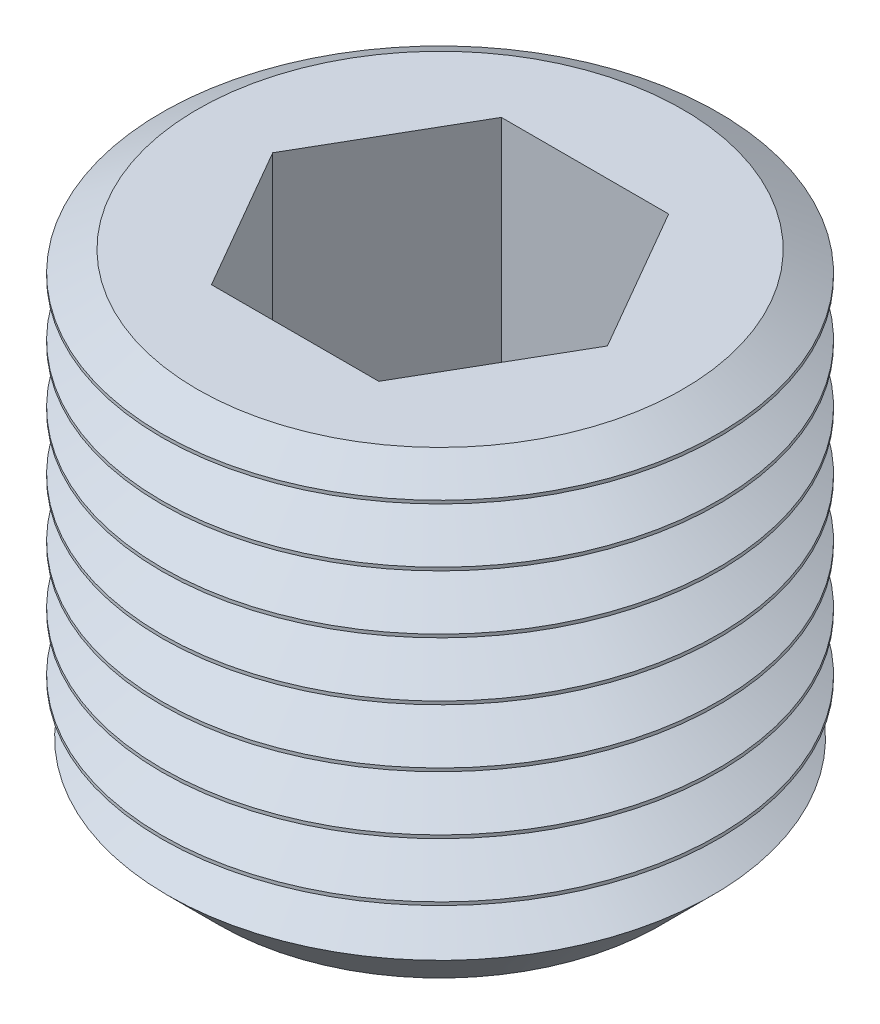
ISO-10303-21;
HEADER;
FILE_DESCRIPTION(('STEP AP214'),'2;1');
FILE_NAME('part.step','',(''),(''),'','','');
FILE_SCHEMA(('AUTOMOTIVE_DESIGN { 1 0 10303 214 1 1 1 1 }'));
ENDSEC;
DATA;
#1=APPLICATION_CONTEXT('core data for automotive mechanical design processes');
#2=APPLICATION_PROTOCOL_DEFINITION('international standard','automotive_design',2000,#1);
#3=PRODUCT_CONTEXT('',#1,'mechanical');
#4=PRODUCT('Part','Part','',(#3));
#5=PRODUCT_RELATED_PRODUCT_CATEGORY('part','',(#4));
#6=PRODUCT_DEFINITION_FORMATION('','',#4);
#7=PRODUCT_DEFINITION_CONTEXT('part definition',#1,'design');
#8=PRODUCT_DEFINITION('design','',#6,#7);
#9=PRODUCT_DEFINITION_SHAPE('','',#8);
#10=(LENGTH_UNIT() NAMED_UNIT(*) SI_UNIT(.MILLI.,.METRE.));
#11=(NAMED_UNIT(*) PLANE_ANGLE_UNIT() SI_UNIT($,.RADIAN.));
#12=(NAMED_UNIT(*) SI_UNIT($,.STERADIAN.) SOLID_ANGLE_UNIT());
#13=UNCERTAINTY_MEASURE_WITH_UNIT(LENGTH_MEASURE(1.E-05),#10,'distance_accuracy_value','');
#14=(GEOMETRIC_REPRESENTATION_CONTEXT(3) GLOBAL_UNCERTAINTY_ASSIGNED_CONTEXT((#13)) GLOBAL_UNIT_ASSIGNED_CONTEXT((#10,
#11,#12)) REPRESENTATION_CONTEXT('',''));
#15=CARTESIAN_POINT('',(0.,0.,0.));
#16=DIRECTION('',(0.,0.,1.));
#17=DIRECTION('',(1.,0.,0.));
#18=AXIS2_PLACEMENT_3D('',#15,#16,#17);
#19=CARTESIAN_POINT('',(6.01723710062803E-11,-3.64906545824845,0.));
#20=DIRECTION('',(0.,1.,0.));
#21=DIRECTION('',(0.,0.,1.));
#22=AXIS2_PLACEMENT_3D('',#19,#20,#21);
#23=CONICAL_SURFACE('',#22,2.35093454176649,0.785398163397449);
#24=CARTESIAN_POINT('',(6.01723710062803E-11,-4.09999999998029,0.));
#25=DIRECTION('',(0.,1.,0.));
#26=DIRECTION('',(0.,0.,1.));
#27=AXIS2_PLACEMENT_3D('',#24,#25,#26);
#28=CIRCLE('',#27,1.90000000003465);
#29=CARTESIAN_POINT('',(6.01723710062803E-11,-4.09999999998029,1.90000000003465));
#30=VERTEX_POINT('',#29);
#31=EDGE_CURVE('E140',#30,#30,#28,.T.);
#32=ORIENTED_EDGE('',*,*,#31,.T.);
#33=EDGE_LOOP('',(#32));
#34=FACE_BOUND('',#33,.T.);
#35=CARTESIAN_POINT('',(6.01723710062803E-11,-3.64906545824845,0.));
#36=DIRECTION('',(0.,1.,0.));
#37=DIRECTION('',(0.,0.,1.));
#38=AXIS2_PLACEMENT_3D('',#35,#36,#37);
#39=CIRCLE('',#38,2.35093454176649);
#40=CARTESIAN_POINT('',(6.01723710062803E-11,-3.64906545824845,2.35093454176649));
#41=VERTEX_POINT('',#40);
#42=EDGE_CURVE('E11',#41,#41,#39,.T.);
#43=ORIENTED_EDGE('',*,*,#42,.F.);
#44=EDGE_LOOP('',(#43));
#45=FACE_BOUND('',#44,.T.);
#46=ADVANCED_FACE('F39',(#34,#45),#23,.T.);
#47=CARTESIAN_POINT('',(6.01723710062803E-11,-3.44123448050846,0.));
#48=DIRECTION('',(0.,-1.,0.));
#49=DIRECTION('',(0.,0.,-1.));
#50=AXIS2_PLACEMENT_3D('',#47,#48,#49);
#51=CONICAL_SURFACE('',#50,1.99096072893412,1.0471975511966);
#52=ORIENTED_EDGE('',*,*,#42,.T.);
#53=EDGE_LOOP('',(#52));
#54=FACE_BOUND('',#53,.T.);
#55=CARTESIAN_POINT('',(6.01723710062803E-11,-3.44123448050846,0.));
#56=DIRECTION('',(0.,1.,0.));
#57=DIRECTION('',(0.,0.,1.));
#58=AXIS2_PLACEMENT_3D('',#55,#56,#57);
#59=CIRCLE('',#58,1.99096072893412);
#60=CARTESIAN_POINT('',(6.01723710062803E-11,-3.44123448050846,1.99096072893412));
#61=VERTEX_POINT('',#60);
#62=EDGE_CURVE('E46',#61,#61,#59,.T.);
#63=ORIENTED_EDGE('',*,*,#62,.F.);
#64=EDGE_LOOP('',(#63));
#65=FACE_BOUND('',#64,.T.);
#66=ADVANCED_FACE('F216',(#54,#65),#51,.T.);
#67=CARTESIAN_POINT('',(6.01723710062803E-11,-3.20507554727101,0.));
#68=DIRECTION('',(0.,1.,0.));
#69=DIRECTION('',(0.,0.,1.));
#70=AXIS2_PLACEMENT_3D('',#67,#68,#69);
#71=CONICAL_SURFACE('',#70,2.39999999996266,1.0471975511966);
#72=ORIENTED_EDGE('',*,*,#62,.T.);
#73=EDGE_LOOP('',(#72));
#74=FACE_BOUND('',#73,.T.);
#75=CARTESIAN_POINT('',(6.01723710062803E-11,-3.20507554727101,0.));
#76=DIRECTION('',(0.,1.,0.));
#77=DIRECTION('',(0.,0.,1.));
#78=AXIS2_PLACEMENT_3D('',#75,#76,#77);
#79=CIRCLE('',#78,2.39999999996266);
#80=CARTESIAN_POINT('',(6.01723710062803E-11,-3.20507554727101,2.39999999996266));
#81=VERTEX_POINT('',#80);
#82=EDGE_CURVE('E208',#81,#81,#79,.T.);
#83=ORIENTED_EDGE('',*,*,#82,.F.);
#84=EDGE_LOOP('',(#83));
#85=FACE_BOUND('',#84,.T.);
#86=ADVANCED_FACE('F213',(#74,#85),#71,.T.);
#87=CARTESIAN_POINT('',(6.01723710062803E-11,-4.09999999998029,0.));
#88=DIRECTION('',(0.,1.,0.));
#89=DIRECTION('',(0.,0.,1.));
#90=AXIS2_PLACEMENT_3D('',#87,#88,#89);
#91=CYLINDRICAL_SURFACE('',#90,2.39999999996266);
#92=ORIENTED_EDGE('',*,*,#82,.T.);
#93=EDGE_LOOP('',(#92));
#94=FACE_BOUND('',#93,.T.);
#95=CARTESIAN_POINT('',(6.01723710062803E-11,-3.17739341374713,0.));
#96=DIRECTION('',(0.,1.,0.));
#97=DIRECTION('',(0.,0.,1.));
#98=AXIS2_PLACEMENT_3D('',#95,#96,#97);
#99=CIRCLE('',#98,2.39999999996266);
#100=CARTESIAN_POINT('',(6.01723710062803E-11,-3.17739341374713,2.39999999996266));
#101=VERTEX_POINT('',#100);
#102=EDGE_CURVE('E205',#101,#101,#99,.T.);
#103=ORIENTED_EDGE('',*,*,#102,.F.);
#104=EDGE_LOOP('',(#103));
#105=FACE_BOUND('',#104,.T.);
#106=ADVANCED_FACE('F223',(#94,#105),#91,.T.);
#107=CARTESIAN_POINT('',(6.01723710062803E-11,-2.9412344805723,0.));
#108=DIRECTION('',(0.,-1.,0.));
#109=DIRECTION('',(0.,0.,-1.));
#110=AXIS2_PLACEMENT_3D('',#107,#108,#109);
#111=CONICAL_SURFACE('',#110,1.99096072894248,1.04719755130257);
#112=ORIENTED_EDGE('',*,*,#102,.T.);
#113=EDGE_LOOP('',(#112));
#114=FACE_BOUND('',#113,.T.);
#115=CARTESIAN_POINT('',(6.01723710062803E-11,-2.9412344805723,0.));
#116=DIRECTION('',(0.,1.,0.));
#117=DIRECTION('',(0.,0.,1.));
#118=AXIS2_PLACEMENT_3D('',#115,#116,#117);
#119=CIRCLE('',#118,1.99096072894248);
#120=CARTESIAN_POINT('',(6.01723710062803E-11,-2.9412344805723,1.99096072894248));
#121=VERTEX_POINT('',#120);
#122=EDGE_CURVE('E202',#121,#121,#119,.T.);
#123=ORIENTED_EDGE('',*,*,#122,.F.);
#124=EDGE_LOOP('',(#123));
#125=FACE_BOUND('',#124,.T.);
#126=ADVANCED_FACE('F229',(#114,#125),#111,.T.);
#127=CARTESIAN_POINT('',(6.01723710062803E-11,-2.70507554733967,0.));
#128=DIRECTION('',(0.,1.,0.));
#129=DIRECTION('',(0.,0.,1.));
#130=AXIS2_PLACEMENT_3D('',#127,#128,#129);
#131=CONICAL_SURFACE('',#130,2.39999999996266,1.0471975511966);
#132=ORIENTED_EDGE('',*,*,#122,.T.);
#133=EDGE_LOOP('',(#132));
#134=FACE_BOUND('',#133,.T.);
#135=CARTESIAN_POINT('',(6.01723710062803E-11,-2.70507554733967,0.));
#136=DIRECTION('',(0.,1.,0.));
#137=DIRECTION('',(0.,0.,1.));
#138=AXIS2_PLACEMENT_3D('',#135,#136,#137);
#139=CIRCLE('',#138,2.39999999996266);
#140=CARTESIAN_POINT('',(6.01723710062803E-11,-2.70507554733967,2.39999999996266));
#141=VERTEX_POINT('',#140);
#142=EDGE_CURVE('E199',#141,#141,#139,.T.);
#143=ORIENTED_EDGE('',*,*,#142,.F.);
#144=EDGE_LOOP('',(#143));
#145=FACE_BOUND('',#144,.T.);
#146=ADVANCED_FACE('F233',(#134,#145),#131,.T.);
#147=CARTESIAN_POINT('',(6.01723710062803E-11,-4.09999999998029,0.));
#148=DIRECTION('',(0.,1.,0.));
#149=DIRECTION('',(0.,0.,1.));
#150=AXIS2_PLACEMENT_3D('',#147,#148,#149);
#151=CYLINDRICAL_SURFACE('',#150,2.39999999996266);
#152=ORIENTED_EDGE('',*,*,#142,.T.);
#153=EDGE_LOOP('',(#152));
#154=FACE_BOUND('',#153,.T.);
#155=CARTESIAN_POINT('',(6.01723710062803E-11,-2.67739341374713,0.));
#156=DIRECTION('',(0.,1.,0.));
#157=DIRECTION('',(0.,0.,1.));
#158=AXIS2_PLACEMENT_3D('',#155,#156,#157);
#159=CIRCLE('',#158,2.39999999996266);
#160=CARTESIAN_POINT('',(6.01723710062803E-11,-2.67739341374713,2.39999999996266));
#161=VERTEX_POINT('',#160);
#162=EDGE_CURVE('E196',#161,#161,#159,.T.);
#163=ORIENTED_EDGE('',*,*,#162,.F.);
#164=EDGE_LOOP('',(#163));
#165=FACE_BOUND('',#164,.T.);
#166=ADVANCED_FACE('F237',(#154,#165),#151,.T.);
#167=CARTESIAN_POINT('',(6.01723710062803E-11,-2.44123448047805,0.));
#168=DIRECTION('',(0.,-1.,0.));
#169=DIRECTION('',(0.,0.,-1.));
#170=AXIS2_PLACEMENT_3D('',#167,#168,#169);
#171=CONICAL_SURFACE('',#170,1.99096072892929,1.04719755114372);
#172=ORIENTED_EDGE('',*,*,#162,.T.);
#173=EDGE_LOOP('',(#172));
#174=FACE_BOUND('',#173,.T.);
#175=CARTESIAN_POINT('',(6.01723710062803E-11,-2.44123448047805,0.));
#176=DIRECTION('',(0.,1.,0.));
#177=DIRECTION('',(0.,0.,1.));
#178=AXIS2_PLACEMENT_3D('',#175,#176,#177);
#179=CIRCLE('',#178,1.99096072892929);
#180=CARTESIAN_POINT('',(6.01723710062803E-11,-2.44123448047805,1.99096072892929));
#181=VERTEX_POINT('',#180);
#182=EDGE_CURVE('E193',#181,#181,#179,.T.);
#183=ORIENTED_EDGE('',*,*,#182,.F.);
#184=EDGE_LOOP('',(#183));
#185=FACE_BOUND('',#184,.T.);
#186=ADVANCED_FACE('F241',(#174,#185),#171,.T.);
#187=CARTESIAN_POINT('',(6.01723710062803E-11,-2.20507554723781,0.));
#188=DIRECTION('',(0.,1.,0.));
#189=DIRECTION('',(0.,0.,1.));
#190=AXIS2_PLACEMENT_3D('',#187,#188,#189);
#191=CONICAL_SURFACE('',#190,2.39999999996266,1.0471975511966);
#192=ORIENTED_EDGE('',*,*,#182,.T.);
#193=EDGE_LOOP('',(#192));
#194=FACE_BOUND('',#193,.T.);
#195=CARTESIAN_POINT('',(6.01723710062803E-11,-2.20507554723781,0.));
#196=DIRECTION('',(0.,1.,0.));
#197=DIRECTION('',(0.,0.,1.));
#198=AXIS2_PLACEMENT_3D('',#195,#196,#197);
#199=CIRCLE('',#198,2.39999999996266);
#200=CARTESIAN_POINT('',(6.01723710062803E-11,-2.20507554723781,2.39999999996266));
#201=VERTEX_POINT('',#200);
#202=EDGE_CURVE('E190',#201,#201,#199,.T.);
#203=ORIENTED_EDGE('',*,*,#202,.F.);
#204=EDGE_LOOP('',(#203));
#205=FACE_BOUND('',#204,.T.);
#206=ADVANCED_FACE('F245',(#194,#205),#191,.T.);
#207=CARTESIAN_POINT('',(6.01723710062803E-11,-4.09999999998029,0.));
#208=DIRECTION('',(0.,1.,0.));
#209=DIRECTION('',(0.,0.,1.));
#210=AXIS2_PLACEMENT_3D('',#207,#208,#209);
#211=CYLINDRICAL_SURFACE('',#210,2.39999999996266);
#212=ORIENTED_EDGE('',*,*,#202,.T.);
#213=EDGE_LOOP('',(#212));
#214=FACE_BOUND('',#213,.T.);
#215=CARTESIAN_POINT('',(6.01723710062803E-11,-2.17739341374713,0.));
#216=DIRECTION('',(0.,1.,0.));
#217=DIRECTION('',(0.,0.,1.));
#218=AXIS2_PLACEMENT_3D('',#215,#216,#217);
#219=CIRCLE('',#218,2.39999999996266);
#220=CARTESIAN_POINT('',(6.01723710062803E-11,-2.17739341374713,2.39999999996266));
#221=VERTEX_POINT('',#220);
#222=EDGE_CURVE('E187',#221,#221,#219,.T.);
#223=ORIENTED_EDGE('',*,*,#222,.F.);
#224=EDGE_LOOP('',(#223));
#225=FACE_BOUND('',#224,.T.);
#226=ADVANCED_FACE('F249',(#214,#225),#211,.T.);
#227=CARTESIAN_POINT('',(6.01723710062803E-11,-1.94123448048988,0.));
#228=DIRECTION('',(0.,-1.,0.));
#229=DIRECTION('',(0.,0.,-1.));
#230=AXIS2_PLACEMENT_3D('',#227,#228,#229);
#231=CONICAL_SURFACE('',#230,1.99096072892929,1.0471975511654);
#232=ORIENTED_EDGE('',*,*,#222,.T.);
#233=EDGE_LOOP('',(#232));
#234=FACE_BOUND('',#233,.T.);
#235=CARTESIAN_POINT('',(6.01723710062803E-11,-1.94123448048988,0.));
#236=DIRECTION('',(0.,1.,0.));
#237=DIRECTION('',(0.,0.,1.));
#238=AXIS2_PLACEMENT_3D('',#235,#236,#237);
#239=CIRCLE('',#238,1.99096072892929);
#240=CARTESIAN_POINT('',(6.01723710062803E-11,-1.94123448048988,1.99096072892929));
#241=VERTEX_POINT('',#240);
#242=EDGE_CURVE('E184',#241,#241,#239,.T.);
#243=ORIENTED_EDGE('',*,*,#242,.F.);
#244=EDGE_LOOP('',(#243));
#245=FACE_BOUND('',#244,.T.);
#246=ADVANCED_FACE('F253',(#234,#245),#231,.T.);
#247=CARTESIAN_POINT('',(6.01723710062803E-11,-1.70507554724963,0.));
#248=DIRECTION('',(0.,1.,0.));
#249=DIRECTION('',(0.,0.,1.));
#250=AXIS2_PLACEMENT_3D('',#247,#248,#249);
#251=CONICAL_SURFACE('',#250,2.39999999996266,1.0471975511966);
#252=ORIENTED_EDGE('',*,*,#242,.T.);
#253=EDGE_LOOP('',(#252));
#254=FACE_BOUND('',#253,.T.);
#255=CARTESIAN_POINT('',(6.01723710062803E-11,-1.70507554724963,0.));
#256=DIRECTION('',(0.,1.,0.));
#257=DIRECTION('',(0.,0.,1.));
#258=AXIS2_PLACEMENT_3D('',#255,#256,#257);
#259=CIRCLE('',#258,2.39999999996266);
#260=CARTESIAN_POINT('',(6.01723710062803E-11,-1.70507554724963,2.39999999996266));
#261=VERTEX_POINT('',#260);
#262=EDGE_CURVE('E181',#261,#261,#259,.T.);
#263=ORIENTED_EDGE('',*,*,#262,.F.);
#264=EDGE_LOOP('',(#263));
#265=FACE_BOUND('',#264,.T.);
#266=ADVANCED_FACE('F257',(#254,#265),#251,.T.);
#267=CARTESIAN_POINT('',(6.01723710062803E-11,-4.09999999998029,0.));
#268=DIRECTION('',(0.,1.,0.));
#269=DIRECTION('',(0.,0.,1.));
#270=AXIS2_PLACEMENT_3D('',#267,#268,#269);
#271=CYLINDRICAL_SURFACE('',#270,2.39999999996266);
#272=ORIENTED_EDGE('',*,*,#262,.T.);
#273=EDGE_LOOP('',(#272));
#274=FACE_BOUND('',#273,.T.);
#275=CARTESIAN_POINT('',(6.01723710062803E-11,-1.67739341374713,0.));
#276=DIRECTION('',(0.,1.,0.));
#277=DIRECTION('',(0.,0.,1.));
#278=AXIS2_PLACEMENT_3D('',#275,#276,#277);
#279=CIRCLE('',#278,2.39999999996266);
#280=CARTESIAN_POINT('',(6.01723710062803E-11,-1.67739341374713,2.39999999996266));
#281=VERTEX_POINT('',#280);
#282=EDGE_CURVE('E178',#281,#281,#279,.T.);
#283=ORIENTED_EDGE('',*,*,#282,.F.);
#284=EDGE_LOOP('',(#283));
#285=FACE_BOUND('',#284,.T.);
#286=ADVANCED_FACE('F261',(#274,#285),#271,.T.);
#287=CARTESIAN_POINT('',(6.01723710062803E-11,-1.4412344805017,0.));
#288=DIRECTION('',(0.,-1.,0.));
#289=DIRECTION('',(0.,0.,-1.));
#290=AXIS2_PLACEMENT_3D('',#287,#288,#289);
#291=CONICAL_SURFACE('',#290,1.99096072892929,1.04719755118708);
#292=ORIENTED_EDGE('',*,*,#282,.T.);
#293=EDGE_LOOP('',(#292));
#294=FACE_BOUND('',#293,.T.);
#295=CARTESIAN_POINT('',(6.01723710062803E-11,-1.4412344805017,0.));
#296=DIRECTION('',(0.,1.,0.));
#297=DIRECTION('',(0.,0.,1.));
#298=AXIS2_PLACEMENT_3D('',#295,#296,#297);
#299=CIRCLE('',#298,1.99096072892929);
#300=CARTESIAN_POINT('',(6.01723710062803E-11,-1.4412344805017,1.99096072892929));
#301=VERTEX_POINT('',#300);
#302=EDGE_CURVE('E175',#301,#301,#299,.T.);
#303=ORIENTED_EDGE('',*,*,#302,.F.);
#304=EDGE_LOOP('',(#303));
#305=FACE_BOUND('',#304,.T.);
#306=ADVANCED_FACE('F265',(#294,#305),#291,.T.);
#307=CARTESIAN_POINT('',(6.01723710062803E-11,-1.20507554726146,0.));
#308=DIRECTION('',(0.,1.,0.));
#309=DIRECTION('',(0.,0.,1.));
#310=AXIS2_PLACEMENT_3D('',#307,#308,#309);
#311=CONICAL_SURFACE('',#310,2.39999999996266,1.0471975511966);
#312=ORIENTED_EDGE('',*,*,#302,.T.);
#313=EDGE_LOOP('',(#312));
#314=FACE_BOUND('',#313,.T.);
#315=CARTESIAN_POINT('',(6.01723710062803E-11,-1.20507554726146,0.));
#316=DIRECTION('',(0.,1.,0.));
#317=DIRECTION('',(0.,0.,1.));
#318=AXIS2_PLACEMENT_3D('',#315,#316,#317);
#319=CIRCLE('',#318,2.39999999996266);
#320=CARTESIAN_POINT('',(6.01723710062803E-11,-1.20507554726146,2.39999999996266));
#321=VERTEX_POINT('',#320);
#322=EDGE_CURVE('E172',#321,#321,#319,.T.);
#323=ORIENTED_EDGE('',*,*,#322,.F.);
#324=EDGE_LOOP('',(#323));
#325=FACE_BOUND('',#324,.T.);
#326=ADVANCED_FACE('F269',(#314,#325),#311,.T.);
#327=CARTESIAN_POINT('',(6.01723710062803E-11,-4.09999999998029,0.));
#328=DIRECTION('',(0.,1.,0.));
#329=DIRECTION('',(0.,0.,1.));
#330=AXIS2_PLACEMENT_3D('',#327,#328,#329);
#331=CYLINDRICAL_SURFACE('',#330,2.39999999996266);
#332=ORIENTED_EDGE('',*,*,#322,.T.);
#333=EDGE_LOOP('',(#332));
#334=FACE_BOUND('',#333,.T.);
#335=CARTESIAN_POINT('',(6.01723710062803E-11,-1.17739341374713,0.));
#336=DIRECTION('',(0.,1.,0.));
#337=DIRECTION('',(0.,0.,1.));
#338=AXIS2_PLACEMENT_3D('',#335,#336,#337);
#339=CIRCLE('',#338,2.39999999996266);
#340=CARTESIAN_POINT('',(6.01723710062803E-11,-1.17739341374713,2.39999999996266));
#341=VERTEX_POINT('',#340);
#342=EDGE_CURVE('E169',#341,#341,#339,.T.);
#343=ORIENTED_EDGE('',*,*,#342,.F.);
#344=EDGE_LOOP('',(#343));
#345=FACE_BOUND('',#344,.T.);
#346=ADVANCED_FACE('F273',(#334,#345),#331,.T.);
#347=CARTESIAN_POINT('',(6.01723710062803E-11,-0.941234480513524,0.));
#348=DIRECTION('',(0.,-1.,0.));
#349=DIRECTION('',(0.,0.,-1.));
#350=AXIS2_PLACEMENT_3D('',#347,#348,#349);
#351=CONICAL_SURFACE('',#350,1.99096072892929,1.04719755120876);
#352=ORIENTED_EDGE('',*,*,#342,.T.);
#353=EDGE_LOOP('',(#352));
#354=FACE_BOUND('',#353,.T.);
#355=CARTESIAN_POINT('',(6.01723710062803E-11,-0.941234480513524,0.));
#356=DIRECTION('',(0.,1.,0.));
#357=DIRECTION('',(0.,0.,1.));
#358=AXIS2_PLACEMENT_3D('',#355,#356,#357);
#359=CIRCLE('',#358,1.99096072892929);
#360=CARTESIAN_POINT('',(6.01723710062803E-11,-0.941234480513524,1.99096072892929));
#361=VERTEX_POINT('',#360);
#362=EDGE_CURVE('E166',#361,#361,#359,.T.);
#363=ORIENTED_EDGE('',*,*,#362,.F.);
#364=EDGE_LOOP('',(#363));
#365=FACE_BOUND('',#364,.T.);
#366=ADVANCED_FACE('F277',(#354,#365),#351,.T.);
#367=CARTESIAN_POINT('',(6.01723710062803E-11,-0.705075547273282,0.));
#368=DIRECTION('',(0.,1.,0.));
#369=DIRECTION('',(0.,0.,1.));
#370=AXIS2_PLACEMENT_3D('',#367,#368,#369);
#371=CONICAL_SURFACE('',#370,2.39999999996266,1.0471975511966);
#372=ORIENTED_EDGE('',*,*,#362,.T.);
#373=EDGE_LOOP('',(#372));
#374=FACE_BOUND('',#373,.T.);
#375=CARTESIAN_POINT('',(6.01723710062803E-11,-0.705075547273282,0.));
#376=DIRECTION('',(0.,1.,0.));
#377=DIRECTION('',(0.,0.,1.));
#378=AXIS2_PLACEMENT_3D('',#375,#376,#377);
#379=CIRCLE('',#378,2.39999999996266);
#380=CARTESIAN_POINT('',(6.01723710062803E-11,-0.705075547273282,2.39999999996266));
#381=VERTEX_POINT('',#380);
#382=EDGE_CURVE('E163',#381,#381,#379,.T.);
#383=ORIENTED_EDGE('',*,*,#382,.F.);
#384=EDGE_LOOP('',(#383));
#385=FACE_BOUND('',#384,.T.);
#386=ADVANCED_FACE('F281',(#374,#385),#371,.T.);
#387=CARTESIAN_POINT('',(6.01723710062803E-11,-4.09999999998029,0.));
#388=DIRECTION('',(0.,1.,0.));
#389=DIRECTION('',(0.,0.,1.));
#390=AXIS2_PLACEMENT_3D('',#387,#388,#389);
#391=CYLINDRICAL_SURFACE('',#390,2.39999999996266);
#392=ORIENTED_EDGE('',*,*,#382,.T.);
#393=EDGE_LOOP('',(#392));
#394=FACE_BOUND('',#393,.T.);
#395=CARTESIAN_POINT('',(6.01723710062803E-11,-0.677393413747134,0.));
#396=DIRECTION('',(0.,1.,0.));
#397=DIRECTION('',(0.,0.,1.));
#398=AXIS2_PLACEMENT_3D('',#395,#396,#397);
#399=CIRCLE('',#398,2.39999999996266);
#400=CARTESIAN_POINT('',(6.01723710062803E-11,-0.677393413747134,2.39999999996266));
#401=VERTEX_POINT('',#400);
#402=EDGE_CURVE('E160',#401,#401,#399,.T.);
#403=ORIENTED_EDGE('',*,*,#402,.F.);
#404=EDGE_LOOP('',(#403));
#405=FACE_BOUND('',#404,.T.);
#406=ADVANCED_FACE('F285',(#394,#405),#391,.T.);
#407=CARTESIAN_POINT('',(6.01723710062803E-11,-0.441234480525347,0.));
#408=DIRECTION('',(0.,-1.,0.));
#409=DIRECTION('',(0.,0.,-1.));
#410=AXIS2_PLACEMENT_3D('',#407,#408,#409);
#411=CONICAL_SURFACE('',#410,1.99096072892929,1.04719755123044);
#412=ORIENTED_EDGE('',*,*,#402,.T.);
#413=EDGE_LOOP('',(#412));
#414=FACE_BOUND('',#413,.T.);
#415=CARTESIAN_POINT('',(6.01723710062803E-11,-0.441234480525347,0.));
#416=DIRECTION('',(0.,1.,0.));
#417=DIRECTION('',(0.,0.,1.));
#418=AXIS2_PLACEMENT_3D('',#415,#416,#417);
#419=CIRCLE('',#418,1.99096072892929);
#420=CARTESIAN_POINT('',(6.01723710062803E-11,-0.441234480525347,1.99096072892929));
#421=VERTEX_POINT('',#420);
#422=EDGE_CURVE('E157',#421,#421,#419,.T.);
#423=ORIENTED_EDGE('',*,*,#422,.F.);
#424=EDGE_LOOP('',(#423));
#425=FACE_BOUND('',#424,.T.);
#426=ADVANCED_FACE('F289',(#414,#425),#411,.T.);
#427=CARTESIAN_POINT('',(6.01723710062803E-11,-0.205075547285105,0.));
#428=DIRECTION('',(0.,1.,0.));
#429=DIRECTION('',(0.,0.,1.));
#430=AXIS2_PLACEMENT_3D('',#427,#428,#429);
#431=CONICAL_SURFACE('',#430,2.39999999996266,1.0471975511966);
#432=ORIENTED_EDGE('',*,*,#422,.T.);
#433=EDGE_LOOP('',(#432));
#434=FACE_BOUND('',#433,.T.);
#435=CARTESIAN_POINT('',(6.01723710062803E-11,-0.205075547285105,0.));
#436=DIRECTION('',(0.,1.,0.));
#437=DIRECTION('',(0.,0.,1.));
#438=AXIS2_PLACEMENT_3D('',#435,#436,#437);
#439=CIRCLE('',#438,2.39999999996266);
#440=CARTESIAN_POINT('',(6.01723710062803E-11,-0.205075547285105,2.39999999996266));
#441=VERTEX_POINT('',#440);
#442=EDGE_CURVE('E154',#441,#441,#439,.T.);
#443=ORIENTED_EDGE('',*,*,#442,.F.);
#444=EDGE_LOOP('',(#443));
#445=FACE_BOUND('',#444,.T.);
#446=ADVANCED_FACE('F293',(#434,#445),#431,.T.);
#447=CARTESIAN_POINT('',(6.01723710062803E-11,-4.09999999998029,0.));
#448=DIRECTION('',(0.,1.,0.));
#449=DIRECTION('',(0.,0.,1.));
#450=AXIS2_PLACEMENT_3D('',#447,#448,#449);
#451=CYLINDRICAL_SURFACE('',#450,2.39999999996266);
#452=ORIENTED_EDGE('',*,*,#442,.T.);
#453=EDGE_LOOP('',(#452));
#454=FACE_BOUND('',#453,.T.);
#455=CARTESIAN_POINT('',(6.01723710062803E-11,-0.177393413747133,0.));
#456=DIRECTION('',(0.,1.,0.));
#457=DIRECTION('',(0.,0.,1.));
#458=AXIS2_PLACEMENT_3D('',#455,#456,#457);
#459=CIRCLE('',#458,2.39999999996266);
#460=CARTESIAN_POINT('',(6.01723710062803E-11,-0.177393413747133,2.39999999996266));
#461=VERTEX_POINT('',#460);
#462=EDGE_CURVE('E151',#461,#461,#459,.T.);
#463=ORIENTED_EDGE('',*,*,#462,.F.);
#464=EDGE_LOOP('',(#463));
#465=FACE_BOUND('',#464,.T.);
#466=ADVANCED_FACE('F297',(#454,#465),#451,.T.);
#467=CARTESIAN_POINT('',(6.01723710062803E-11,-1.68363586960929E-11,0.));
#468=DIRECTION('',(0.,-1.,0.));
#469=DIRECTION('',(0.,0.,-1.));
#470=AXIS2_PLACEMENT_3D('',#467,#468,#469);
#471=CONICAL_SURFACE('',#470,2.0927455944537,1.0471975511966);
#472=ORIENTED_EDGE('',*,*,#462,.T.);
#473=EDGE_LOOP('',(#472));
#474=FACE_BOUND('',#473,.T.);
#475=CARTESIAN_POINT('',(6.01723710062803E-11,-1.68363586960929E-11,0.));
#476=DIRECTION('',(0.,1.,0.));
#477=DIRECTION('',(0.,0.,1.));
#478=AXIS2_PLACEMENT_3D('',#475,#476,#477);
#479=CIRCLE('',#478,2.0927455944537);
#480=CARTESIAN_POINT('',(6.01723710062803E-11,-1.68363586960929E-11,2.0927455944537));
#481=VERTEX_POINT('',#480);
#482=EDGE_CURVE('E148',#481,#481,#479,.T.);
#483=ORIENTED_EDGE('',*,*,#482,.F.);
#484=EDGE_LOOP('',(#483));
#485=FACE_BOUND('',#484,.T.);
#486=ADVANCED_FACE('F301',(#474,#485),#471,.T.);
#487=CARTESIAN_POINT('',(6.01723710062803E-11,-1.68361916769697E-11,0.));
#488=DIRECTION('',(0.,1.,0.));
#489=DIRECTION('',(0.,0.,1.));
#490=AXIS2_PLACEMENT_3D('',#487,#488,#489);
#491=PLANE('',#490);
#492=DIRECTION('',(-1.,0.,0.));
#493=VECTOR('',#492,1.);
#494=CARTESIAN_POINT('',(0.721687836487032,0.,-1.25));
#495=LINE('',#494,#493);
#496=CARTESIAN_POINT('',(0.721687836487032,0.,-1.25));
#497=VERTEX_POINT('',#496);
#498=CARTESIAN_POINT('',(-0.721687836487033,-1.68361916769697E-11,-1.25));
#499=VERTEX_POINT('',#498);
#500=EDGE_CURVE('E53',#497,#499,#495,.T.);
#501=ORIENTED_EDGE('',*,*,#500,.F.);
#502=DIRECTION('',(-0.5,0.,-0.866025403784438));
#503=VECTOR('',#502,1.);
#504=CARTESIAN_POINT('',(1.44337567297406,0.,0.));
#505=LINE('',#504,#503);
#506=CARTESIAN_POINT('',(1.44337567297406,0.,0.));
#507=VERTEX_POINT('',#506);
#508=EDGE_CURVE('E136',#507,#497,#505,.T.);
#509=ORIENTED_EDGE('',*,*,#508,.F.);
#510=DIRECTION('',(0.499999999999999,0.,-0.866025403784439));
#511=VECTOR('',#510,1.);
#512=CARTESIAN_POINT('',(0.721687836487032,0.,1.25));
#513=LINE('',#512,#511);
#514=CARTESIAN_POINT('',(0.721687836487032,0.,1.25));
#515=VERTEX_POINT('',#514);
#516=EDGE_CURVE('E134',#515,#507,#513,.T.);
#517=ORIENTED_EDGE('',*,*,#516,.F.);
#518=DIRECTION('',(1.,0.,0.));
#519=VECTOR('',#518,1.);
#520=CARTESIAN_POINT('',(-0.721687836487031,0.,1.25));
#521=LINE('',#520,#519);
#522=CARTESIAN_POINT('',(-0.721687836487031,0.,1.25));
#523=VERTEX_POINT('',#522);
#524=EDGE_CURVE('E101',#523,#515,#521,.T.);
#525=ORIENTED_EDGE('',*,*,#524,.F.);
#526=DIRECTION('',(0.5,0.,0.866025403784439));
#527=VECTOR('',#526,1.);
#528=CARTESIAN_POINT('',(-1.44337567297406,0.,0.));
#529=LINE('',#528,#527);
#530=CARTESIAN_POINT('',(-1.44337567297406,0.,0.));
#531=VERTEX_POINT('',#530);
#532=EDGE_CURVE('E130',#531,#523,#529,.T.);
#533=ORIENTED_EDGE('',*,*,#532,.F.);
#534=DIRECTION('',(-0.499999999999999,0.,0.866025403784439));
#535=VECTOR('',#534,1.);
#536=CARTESIAN_POINT('',(-0.721687836487033,0.,-1.25));
#537=LINE('',#536,#535);
#538=EDGE_CURVE('E127',#499,#531,#537,.T.);
#539=ORIENTED_EDGE('',*,*,#538,.F.);
#540=EDGE_LOOP('',(#501,#509,#517,#525,#533,#539));
#541=FACE_BOUND('',#540,.T.);
#542=ORIENTED_EDGE('',*,*,#482,.T.);
#543=EDGE_LOOP('',(#542));
#544=FACE_BOUND('',#543,.T.);
#545=ADVANCED_FACE('F305',(#541,#544),#491,.T.);
#546=CARTESIAN_POINT('',(1.90000000009482,-4.09999999998029,0.));
#547=DIRECTION('',(0.,-1.,0.));
#548=DIRECTION('',(0.,0.,-1.));
#549=AXIS2_PLACEMENT_3D('',#546,#547,#548);
#550=PLANE('',#549);
#551=ORIENTED_EDGE('',*,*,#31,.F.);
#552=EDGE_LOOP('',(#551));
#553=FACE_BOUND('',#552,.T.);
#554=ADVANCED_FACE('F309',(#553),#550,.T.);
#555=CARTESIAN_POINT('',(0.721687836487032,-2.5,-1.25));
#556=DIRECTION('',(0.,0.,-1.));
#557=DIRECTION('',(-1.,0.,0.));
#558=AXIS2_PLACEMENT_3D('',#555,#556,#557);
#559=PLANE('',#558);
#560=ORIENTED_EDGE('',*,*,#500,.T.);
#561=DIRECTION('',(0.,1.,0.));
#562=VECTOR('',#561,1.);
#563=CARTESIAN_POINT('',(-0.721687836487033,-2.5,-1.25));
#564=LINE('',#563,#562);
#565=CARTESIAN_POINT('',(-0.721687836487033,-2.5,-1.25));
#566=VERTEX_POINT('',#565);
#567=EDGE_CURVE('E83',#566,#499,#564,.T.);
#568=ORIENTED_EDGE('',*,*,#567,.F.);
#569=DIRECTION('',(-1.,0.,0.));
#570=VECTOR('',#569,1.);
#571=CARTESIAN_POINT('',(0.721687836487032,-2.5,-1.25));
#572=LINE('',#571,#570);
#573=CARTESIAN_POINT('',(0.721687836487032,-2.5,-1.25));
#574=VERTEX_POINT('',#573);
#575=EDGE_CURVE('E138',#574,#566,#572,.T.);
#576=ORIENTED_EDGE('',*,*,#575,.F.);
#577=DIRECTION('',(0.,1.,0.));
#578=VECTOR('',#577,1.);
#579=CARTESIAN_POINT('',(0.721687836487032,-2.5,-1.25));
#580=LINE('',#579,#578);
#581=EDGE_CURVE('E61',#574,#497,#580,.T.);
#582=ORIENTED_EDGE('',*,*,#581,.T.);
#583=EDGE_LOOP('',(#560,#568,#576,#582));
#584=FACE_BOUND('',#583,.T.);
#585=ADVANCED_FACE('F313',(#584),#559,.F.);
#586=CARTESIAN_POINT('',(1.44337567297406,-2.5,0.));
#587=DIRECTION('',(0.866025403784438,0.,-0.5));
#588=DIRECTION('',(-0.5,0.,-0.866025403784439));
#589=AXIS2_PLACEMENT_3D('',#586,#587,#588);
#590=PLANE('',#589);
#591=ORIENTED_EDGE('',*,*,#508,.T.);
#592=ORIENTED_EDGE('',*,*,#581,.F.);
#593=DIRECTION('',(-0.5,0.,-0.866025403784438));
#594=VECTOR('',#593,1.);
#595=CARTESIAN_POINT('',(1.44337567297406,-2.5,0.));
#596=LINE('',#595,#594);
#597=CARTESIAN_POINT('',(1.44337567297406,-2.5,0.));
#598=VERTEX_POINT('',#597);
#599=EDGE_CURVE('E113',#598,#574,#596,.T.);
#600=ORIENTED_EDGE('',*,*,#599,.F.);
#601=DIRECTION('',(0.,1.,0.));
#602=VECTOR('',#601,1.);
#603=CARTESIAN_POINT('',(1.44337567297406,-2.5,0.));
#604=LINE('',#603,#602);
#605=EDGE_CURVE('E105',#598,#507,#604,.T.);
#606=ORIENTED_EDGE('',*,*,#605,.T.);
#607=EDGE_LOOP('',(#591,#592,#600,#606));
#608=FACE_BOUND('',#607,.T.);
#609=ADVANCED_FACE('F317',(#608),#590,.F.);
#610=CARTESIAN_POINT('',(0.721687836487032,-2.5,1.25));
#611=DIRECTION('',(0.866025403784439,0.,0.5));
#612=DIRECTION('',(0.5,0.,-0.866025403784439));
#613=AXIS2_PLACEMENT_3D('',#610,#611,#612);
#614=PLANE('',#613);
#615=ORIENTED_EDGE('',*,*,#516,.T.);
#616=ORIENTED_EDGE('',*,*,#605,.F.);
#617=DIRECTION('',(0.499999999999999,0.,-0.866025403784439));
#618=VECTOR('',#617,1.);
#619=CARTESIAN_POINT('',(0.721687836487032,-2.5,1.25));
#620=LINE('',#619,#618);
#621=CARTESIAN_POINT('',(0.721687836487032,-2.5,1.25));
#622=VERTEX_POINT('',#621);
#623=EDGE_CURVE('E109',#622,#598,#620,.T.);
#624=ORIENTED_EDGE('',*,*,#623,.F.);
#625=DIRECTION('',(0.,1.,0.));
#626=VECTOR('',#625,1.);
#627=CARTESIAN_POINT('',(0.721687836487032,-2.5,1.25));
#628=LINE('',#627,#626);
#629=EDGE_CURVE('E94',#622,#515,#628,.T.);
#630=ORIENTED_EDGE('',*,*,#629,.T.);
#631=EDGE_LOOP('',(#615,#616,#624,#630));
#632=FACE_BOUND('',#631,.T.);
#633=ADVANCED_FACE('F110',(#632),#614,.F.);
#634=CARTESIAN_POINT('',(-0.721687836487031,-2.5,1.25));
#635=DIRECTION('',(0.,0.,1.));
#636=DIRECTION('',(1.,0.,0.));
#637=AXIS2_PLACEMENT_3D('',#634,#635,#636);
#638=PLANE('',#637);
#639=ORIENTED_EDGE('',*,*,#524,.T.);
#640=ORIENTED_EDGE('',*,*,#629,.F.);
#641=DIRECTION('',(1.,0.,0.));
#642=VECTOR('',#641,1.);
#643=CARTESIAN_POINT('',(-0.721687836487031,-2.5,1.25));
#644=LINE('',#643,#642);
#645=CARTESIAN_POINT('',(-0.721687836487031,-2.5,1.25));
#646=VERTEX_POINT('',#645);
#647=EDGE_CURVE('E98',#646,#622,#644,.T.);
#648=ORIENTED_EDGE('',*,*,#647,.F.);
#649=DIRECTION('',(0.,1.,0.));
#650=VECTOR('',#649,1.);
#651=CARTESIAN_POINT('',(-0.721687836487031,-2.5,1.25));
#652=LINE('',#651,#650);
#653=EDGE_CURVE('E106',#646,#523,#652,.T.);
#654=ORIENTED_EDGE('',*,*,#653,.T.);
#655=EDGE_LOOP('',(#639,#640,#648,#654));
#656=FACE_BOUND('',#655,.T.);
#657=ADVANCED_FACE('F96',(#656),#638,.F.);
#658=CARTESIAN_POINT('',(-1.44337567297406,-2.5,0.));
#659=DIRECTION('',(-0.866025403784438,0.,0.5));
#660=DIRECTION('',(0.5,0.,0.866025403784439));
#661=AXIS2_PLACEMENT_3D('',#658,#659,#660);
#662=PLANE('',#661);
#663=ORIENTED_EDGE('',*,*,#532,.T.);
#664=ORIENTED_EDGE('',*,*,#653,.F.);
#665=DIRECTION('',(0.5,0.,0.866025403784439));
#666=VECTOR('',#665,1.);
#667=CARTESIAN_POINT('',(-1.44337567297406,-2.5,0.));
#668=LINE('',#667,#666);
#669=CARTESIAN_POINT('',(-1.44337567297406,-2.5,0.));
#670=VERTEX_POINT('',#669);
#671=EDGE_CURVE('E119',#670,#646,#668,.T.);
#672=ORIENTED_EDGE('',*,*,#671,.F.);
#673=DIRECTION('',(0.,1.,0.));
#674=VECTOR('',#673,1.);
#675=CARTESIAN_POINT('',(-1.44337567297406,-2.5,0.));
#676=LINE('',#675,#674);
#677=EDGE_CURVE('E143',#670,#531,#676,.T.);
#678=ORIENTED_EDGE('',*,*,#677,.T.);
#679=EDGE_LOOP('',(#663,#664,#672,#678));
#680=FACE_BOUND('',#679,.T.);
#681=ADVANCED_FACE('F321',(#680),#662,.F.);
#682=CARTESIAN_POINT('',(-0.721687836487033,-2.5,-1.25));
#683=DIRECTION('',(-0.866025403784439,0.,-0.499999999999999));
#684=DIRECTION('',(-0.499999999999999,0.,0.866025403784439));
#685=AXIS2_PLACEMENT_3D('',#682,#683,#684);
#686=PLANE('',#685);
#687=ORIENTED_EDGE('',*,*,#538,.T.);
#688=ORIENTED_EDGE('',*,*,#677,.F.);
#689=DIRECTION('',(-0.499999999999999,0.,0.866025403784439));
#690=VECTOR('',#689,1.);
#691=CARTESIAN_POINT('',(-0.721687836487033,-2.5,-1.25));
#692=LINE('',#691,#690);
#693=EDGE_CURVE('E121',#566,#670,#692,.T.);
#694=ORIENTED_EDGE('',*,*,#693,.F.);
#695=ORIENTED_EDGE('',*,*,#567,.T.);
#696=EDGE_LOOP('',(#687,#688,#694,#695));
#697=FACE_BOUND('',#696,.T.);
#698=ADVANCED_FACE('F318',(#697),#686,.F.);
#699=CARTESIAN_POINT('',(0.,-2.5,0.));
#700=DIRECTION('',(0.,1.,0.));
#701=DIRECTION('',(0.,0.,1.));
#702=AXIS2_PLACEMENT_3D('',#699,#700,#701);
#703=PLANE('',#702);
#704=ORIENTED_EDGE('',*,*,#575,.T.);
#705=ORIENTED_EDGE('',*,*,#693,.T.);
#706=ORIENTED_EDGE('',*,*,#671,.T.);
#707=ORIENTED_EDGE('',*,*,#647,.T.);
#708=ORIENTED_EDGE('',*,*,#623,.T.);
#709=ORIENTED_EDGE('',*,*,#599,.T.);
#710=EDGE_LOOP('',(#704,#705,#706,#707,#708,#709));
#711=FACE_BOUND('',#710,.T.);
#712=ADVANCED_FACE('F116',(#711),#703,.T.);
#713=CLOSED_SHELL('',(#46,#66,#86,#106,#126,#146,#166,#186,#206,#226,#246,#266,#286,#306,#326,
#346,#366,#386,#406,#426,#446,#466,#486,#545,#554,#585,#609,#633,#657,#681,#698,#712));
#714=MANIFOLD_SOLID_BREP('B2',#713);
#715=ADVANCED_BREP_SHAPE_REPRESENTATION('',(#18,#714),#14);
#716=SHAPE_DEFINITION_REPRESENTATION(#9,#715);
ENDSEC;
END-ISO-10303-21;
